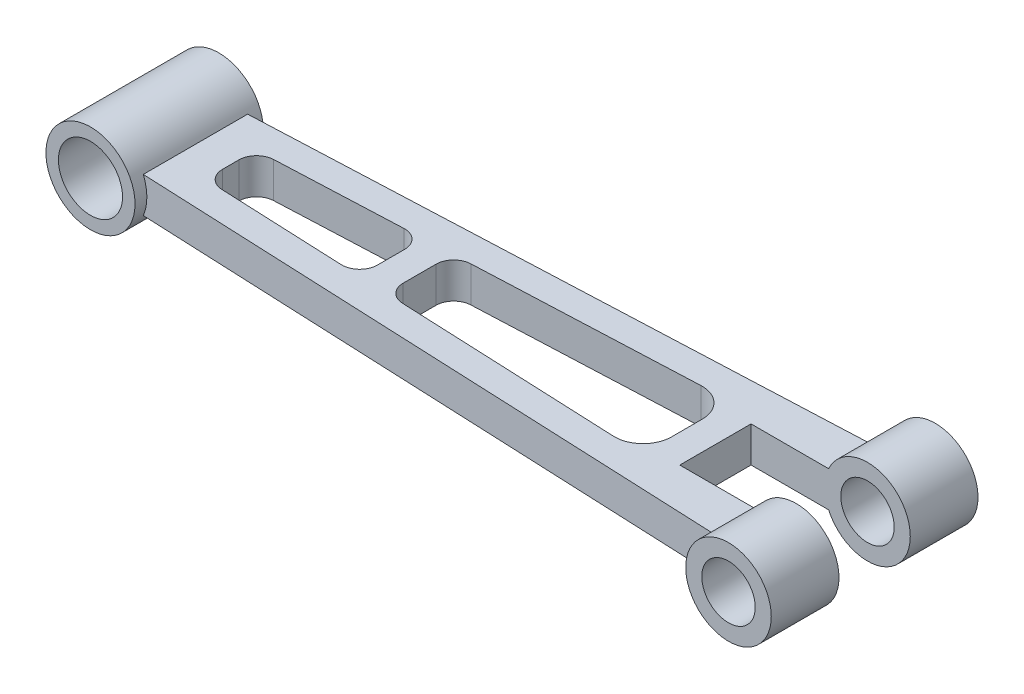
ISO-10303-21;
HEADER;
FILE_DESCRIPTION(('STEP AP214'),'2;1');
FILE_NAME('part.step','',(''),(''),'','','');
FILE_SCHEMA(('AUTOMOTIVE_DESIGN { 1 0 10303 214 1 1 1 1 }'));
ENDSEC;
DATA;
#1=APPLICATION_CONTEXT('core data for automotive mechanical design processes');
#2=APPLICATION_PROTOCOL_DEFINITION('international standard','automotive_design',2000,#1);
#3=PRODUCT_CONTEXT('',#1,'mechanical');
#4=PRODUCT('Part','Part','',(#3));
#5=PRODUCT_RELATED_PRODUCT_CATEGORY('part','',(#4));
#6=PRODUCT_DEFINITION_FORMATION('','',#4);
#7=PRODUCT_DEFINITION_CONTEXT('part definition',#1,'design');
#8=PRODUCT_DEFINITION('design','',#6,#7);
#9=PRODUCT_DEFINITION_SHAPE('','',#8);
#10=(LENGTH_UNIT() NAMED_UNIT(*) SI_UNIT(.MILLI.,.METRE.));
#11=(NAMED_UNIT(*) PLANE_ANGLE_UNIT() SI_UNIT($,.RADIAN.));
#12=(NAMED_UNIT(*) SI_UNIT($,.STERADIAN.) SOLID_ANGLE_UNIT());
#13=UNCERTAINTY_MEASURE_WITH_UNIT(LENGTH_MEASURE(1.E-05),#10,'distance_accuracy_value','');
#14=(GEOMETRIC_REPRESENTATION_CONTEXT(3) GLOBAL_UNCERTAINTY_ASSIGNED_CONTEXT((#13)) GLOBAL_UNIT_ASSIGNED_CONTEXT((#10,
#11,#12)) REPRESENTATION_CONTEXT('',''));
#15=CARTESIAN_POINT('',(0.,0.,0.));
#16=DIRECTION('',(0.,0.,1.));
#17=DIRECTION('',(1.,0.,0.));
#18=AXIS2_PLACEMENT_3D('',#15,#16,#17);
#19=CARTESIAN_POINT('',(95.,0.,29.));
#20=DIRECTION('',(0.,0.,-1.));
#21=DIRECTION('',(-1.,0.,0.));
#22=AXIS2_PLACEMENT_3D('',#19,#20,#21);
#23=CYLINDRICAL_SURFACE('',#22,12.);
#24=CARTESIAN_POINT('',(95.,0.,-29.));
#25=DIRECTION('',(0.,0.,1.));
#26=DIRECTION('',(1.,0.,0.));
#27=AXIS2_PLACEMENT_3D('',#24,#25,#26);
#28=CIRCLE('',#27,12.);
#29=CARTESIAN_POINT('',(107.,0.,-29.));
#30=VERTEX_POINT('',#29);
#31=EDGE_CURVE('E419',#30,#30,#28,.T.);
#32=ORIENTED_EDGE('',*,*,#31,.T.);
#33=EDGE_LOOP('',(#32));
#34=FACE_BOUND('',#33,.T.);
#35=DIRECTION('',(0.,0.,-1.));
#36=VECTOR('',#35,1.);
#37=CARTESIAN_POINT('',(84.0912878853643,5.,29.));
#38=LINE('',#37,#36);
#39=CARTESIAN_POINT('',(84.0912878853643,4.99999999999999,-9.99999999999999));
#40=VERTEX_POINT('',#39);
#41=CARTESIAN_POINT('',(84.0912878853642,5.,-21.9586878261897));
#42=VERTEX_POINT('',#41);
#43=EDGE_CURVE('E432',#40,#42,#38,.T.);
#44=ORIENTED_EDGE('',*,*,#43,.F.);
#45=CARTESIAN_POINT('',(95.,0.,-9.99999999999999));
#46=DIRECTION('',(0.,0.,-1.));
#47=DIRECTION('',(-1.,0.,0.));
#48=AXIS2_PLACEMENT_3D('',#45,#46,#47);
#49=CIRCLE('',#48,12.);
#50=CARTESIAN_POINT('',(84.0912878853643,-4.99999999999999,-9.99999999999999));
#51=VERTEX_POINT('',#50);
#52=EDGE_CURVE('E486',#40,#51,#49,.T.);
#53=ORIENTED_EDGE('',*,*,#52,.T.);
#54=DIRECTION('',(0.,0.,-1.));
#55=VECTOR('',#54,1.);
#56=CARTESIAN_POINT('',(84.0912878853643,-5.,29.));
#57=LINE('',#56,#55);
#58=CARTESIAN_POINT('',(84.0912878853642,-5.,-21.9586878261897));
#59=VERTEX_POINT('',#58);
#60=EDGE_CURVE('E424',#51,#59,#57,.T.);
#61=ORIENTED_EDGE('',*,*,#60,.T.);
#62=CARTESIAN_POINT('',(95.,0.,-22.4349724830322));
#63=DIRECTION('',(-0.0436193873653362,0.,-0.999048221581858));
#64=DIRECTION('',(0.999048221581858,0.,-0.0436193873653362));
#65=AXIS2_PLACEMENT_3D('',#62,#63,#64);
#66=ELLIPSE('',#65,12.0114322219598,12.);
#67=EDGE_CURVE('E437',#42,#59,#66,.F.);
#68=ORIENTED_EDGE('',*,*,#67,.F.);
#69=EDGE_LOOP('',(#44,#53,#61,#68));
#70=FACE_BOUND('',#69,.T.);
#71=ADVANCED_FACE('F46',(#34,#70),#23,.T.);
#72=CARTESIAN_POINT('',(0.,5.,0.));
#73=DIRECTION('',(0.,1.,0.));
#74=DIRECTION('',(0.,0.,1.));
#75=AXIS2_PLACEMENT_3D('',#72,#73,#74);
#76=PLANE('',#75);
#77=CARTESIAN_POINT('',(-33.6693905204358,5.,-3.80476066232324));
#78=DIRECTION('',(0.,1.,0.));
#79=DIRECTION('',(0.,0.,1.));
#80=AXIS2_PLACEMENT_3D('',#77,#78,#79);
#81=CIRCLE('',#80,5.);
#82=CARTESIAN_POINT('',(-28.6693905204358,5.,-3.80476066232321));
#83=VERTEX_POINT('',#82);
#84=CARTESIAN_POINT('',(-33.8874874572625,5.,-8.80000177023253));
#85=VERTEX_POINT('',#84);
#86=EDGE_CURVE('E391',#83,#85,#81,.T.);
#87=ORIENTED_EDGE('',*,*,#86,.F.);
#88=DIRECTION('',(0.,0.,-1.));
#89=VECTOR('',#88,1.);
#90=CARTESIAN_POINT('',(-28.6693905204358,5.,0.));
#91=LINE('',#90,#89);
#92=CARTESIAN_POINT('',(-28.6693905204358,5.,3.80476066232321));
#93=VERTEX_POINT('',#92);
#94=EDGE_CURVE('E388',#93,#83,#91,.T.);
#95=ORIENTED_EDGE('',*,*,#94,.F.);
#96=CARTESIAN_POINT('',(-33.6693905204358,5.,3.80476066232324));
#97=DIRECTION('',(0.,1.,0.));
#98=DIRECTION('',(0.,0.,1.));
#99=AXIS2_PLACEMENT_3D('',#96,#97,#98);
#100=CIRCLE('',#99,5.);
#101=CARTESIAN_POINT('',(-33.8874874572625,5.,8.80000177023253));
#102=VERTEX_POINT('',#101);
#103=EDGE_CURVE('E385',#102,#93,#100,.T.);
#104=ORIENTED_EDGE('',*,*,#103,.F.);
#105=DIRECTION('',(0.999048221581858,0.,0.0436193873653358));
#106=VECTOR('',#105,1.);
#107=CARTESIAN_POINT('',(-0.447961405576194,5.,10.2600030080629));
#108=LINE('',#107,#106);
#109=CARTESIAN_POINT('',(-68.8874874572624,5.,7.27186876843462));
#110=VERTEX_POINT('',#109);
#111=EDGE_CURVE('E382',#110,#102,#108,.T.);
#112=ORIENTED_EDGE('',*,*,#111,.F.);
#113=CARTESIAN_POINT('',(-68.6693905204358,5.,2.27662766052533));
#114=DIRECTION('',(0.,1.,0.));
#115=DIRECTION('',(0.,0.,1.));
#116=AXIS2_PLACEMENT_3D('',#113,#114,#115);
#117=CIRCLE('',#116,5.);
#118=CARTESIAN_POINT('',(-73.6693905204358,5.,2.27662766052529));
#119=VERTEX_POINT('',#118);
#120=EDGE_CURVE('E379',#119,#110,#117,.T.);
#121=ORIENTED_EDGE('',*,*,#120,.F.);
#122=DIRECTION('',(0.,0.,1.));
#123=VECTOR('',#122,1.);
#124=CARTESIAN_POINT('',(-73.6693905204358,5.,0.));
#125=LINE('',#124,#123);
#126=CARTESIAN_POINT('',(-73.6693905204358,5.,-2.27662766052528));
#127=VERTEX_POINT('',#126);
#128=EDGE_CURVE('E376',#127,#119,#125,.T.);
#129=ORIENTED_EDGE('',*,*,#128,.F.);
#130=CARTESIAN_POINT('',(-68.6693905204358,5.,-2.27662766052532));
#131=DIRECTION('',(0.,1.,0.));
#132=DIRECTION('',(0.,0.,1.));
#133=AXIS2_PLACEMENT_3D('',#130,#131,#132);
#134=CIRCLE('',#133,5.);
#135=CARTESIAN_POINT('',(-68.8874874572624,5.,-7.27186876843461));
#136=VERTEX_POINT('',#135);
#137=EDGE_CURVE('E373',#136,#127,#134,.T.);
#138=ORIENTED_EDGE('',*,*,#137,.F.);
#139=DIRECTION('',(-0.999048221581858,0.,0.043619387365336));
#140=VECTOR('',#139,1.);
#141=CARTESIAN_POINT('',(-0.447961405576197,5.,-10.2600030080629));
#142=LINE('',#141,#140);
#143=EDGE_CURVE('E370',#85,#136,#142,.T.);
#144=ORIENTED_EDGE('',*,*,#143,.F.);
#145=EDGE_LOOP('',(#87,#95,#104,#112,#121,#129,#138,#144));
#146=FACE_BOUND('',#145,.T.);
#147=CARTESIAN_POINT('',(-15.6693905204358,5.,4.59065763467646));
#148=DIRECTION('',(0.,1.,0.));
#149=DIRECTION('',(0.,0.,1.));
#150=AXIS2_PLACEMENT_3D('',#147,#148,#149);
#151=CIRCLE('',#150,5.);
#152=CARTESIAN_POINT('',(-20.6693905204358,5.,4.59065763467643));
#153=VERTEX_POINT('',#152);
#154=CARTESIAN_POINT('',(-15.8874874572624,5.,9.58589874258575));
#155=VERTEX_POINT('',#154);
#156=EDGE_CURVE('E226',#153,#155,#151,.T.);
#157=ORIENTED_EDGE('',*,*,#156,.F.);
#158=DIRECTION('',(0.,0.,1.));
#159=VECTOR('',#158,1.);
#160=CARTESIAN_POINT('',(-20.6693905204358,5.,0.));
#161=LINE('',#160,#159);
#162=CARTESIAN_POINT('',(-20.6693905204358,5.,-4.59065763467641));
#163=VERTEX_POINT('',#162);
#164=EDGE_CURVE('E365',#163,#153,#161,.T.);
#165=ORIENTED_EDGE('',*,*,#164,.F.);
#166=CARTESIAN_POINT('',(-15.6693905204358,5.,-4.59065763467645));
#167=DIRECTION('',(0.,1.,0.));
#168=DIRECTION('',(0.,0.,1.));
#169=AXIS2_PLACEMENT_3D('',#166,#167,#168);
#170=CIRCLE('',#169,5.);
#171=CARTESIAN_POINT('',(-15.8874874572624,5.,-9.58589874258574));
#172=VERTEX_POINT('',#171);
#173=EDGE_CURVE('E362',#172,#163,#170,.T.);
#174=ORIENTED_EDGE('',*,*,#173,.F.);
#175=DIRECTION('',(-0.999048221581858,0.,0.0436193873653362));
#176=VECTOR('',#175,1.);
#177=CARTESIAN_POINT('',(-0.447961405576198,5.,-10.2600030080629));
#178=LINE('',#177,#176);
#179=CARTESIAN_POINT('',(45.9816543806414,5.,-12.2871638121691));
#180=VERTEX_POINT('',#179);
#181=EDGE_CURVE('E359',#180,#172,#178,.T.);
#182=ORIENTED_EDGE('',*,*,#181,.F.);
#183=CARTESIAN_POINT('',(46.3306094795642,5.,-4.29477803951424));
#184=DIRECTION('',(0.,1.,0.));
#185=DIRECTION('',(0.,0.,1.));
#186=AXIS2_PLACEMENT_3D('',#183,#184,#185);
#187=CIRCLE('',#186,8.);
#188=CARTESIAN_POINT('',(54.3306094795642,5.,-4.29477803951421));
#189=VERTEX_POINT('',#188);
#190=EDGE_CURVE('E356',#189,#180,#187,.T.);
#191=ORIENTED_EDGE('',*,*,#190,.F.);
#192=DIRECTION('',(0.,0.,-1.));
#193=VECTOR('',#192,1.);
#194=CARTESIAN_POINT('',(54.3306094795642,5.,-1.75559403277547E-13));
#195=LINE('',#194,#193);
#196=CARTESIAN_POINT('',(54.3306094795642,5.,4.29477803951416));
#197=VERTEX_POINT('',#196);
#198=EDGE_CURVE('E353',#197,#189,#195,.T.);
#199=ORIENTED_EDGE('',*,*,#198,.F.);
#200=CARTESIAN_POINT('',(46.3306094795642,5.,4.29477803951424));
#201=DIRECTION('',(0.,1.,0.));
#202=DIRECTION('',(0.,0.,1.));
#203=AXIS2_PLACEMENT_3D('',#200,#201,#202);
#204=CIRCLE('',#203,8.);
#205=CARTESIAN_POINT('',(45.9816543806415,5.,12.2871638121691));
#206=VERTEX_POINT('',#205);
#207=EDGE_CURVE('E350',#206,#197,#204,.T.);
#208=ORIENTED_EDGE('',*,*,#207,.F.);
#209=DIRECTION('',(0.999048221581858,0.,0.0436193873653358));
#210=VECTOR('',#209,1.);
#211=CARTESIAN_POINT('',(-0.447961405576195,5.,10.2600030080629));
#212=LINE('',#211,#210);
#213=EDGE_CURVE('E297',#155,#206,#212,.T.);
#214=ORIENTED_EDGE('',*,*,#213,.F.);
#215=EDGE_LOOP('',(#157,#165,#174,#182,#191,#199,#208,#214));
#216=FACE_BOUND('',#215,.T.);
#217=DIRECTION('',(-1.,0.,0.));
#218=VECTOR('',#217,1.);
#219=CARTESIAN_POINT('',(0.,5.,-9.99999999999999));
#220=LINE('',#219,#218);
#221=CARTESIAN_POINT('',(62.3306094795642,5.,-9.99999999999999));
#222=VERTEX_POINT('',#221);
#223=EDGE_CURVE('E413',#40,#222,#220,.T.);
#224=ORIENTED_EDGE('',*,*,#223,.F.);
#225=ORIENTED_EDGE('',*,*,#43,.T.);
#226=DIRECTION('',(0.999048221581858,0.,-0.0436193873653362));
#227=VECTOR('',#226,1.);
#228=CARTESIAN_POINT('',(-0.796916504498887,5.,-18.2523887807178));
#229=LINE('',#228,#227);
#230=CARTESIAN_POINT('',(-83.5435607626103,5.,-14.6395922698934));
#231=VERTEX_POINT('',#230);
#232=EDGE_CURVE('E442',#231,#42,#229,.T.);
#233=ORIENTED_EDGE('',*,*,#232,.F.);
#234=DIRECTION('',(0.,0.,-1.));
#235=VECTOR('',#234,1.);
#236=CARTESIAN_POINT('',(-83.5435607626104,5.,18.));
#237=LINE('',#236,#235);
#238=CARTESIAN_POINT('',(-83.5435607626103,5.,14.6395922698934));
#239=VERTEX_POINT('',#238);
#240=EDGE_CURVE('E475',#239,#231,#237,.T.);
#241=ORIENTED_EDGE('',*,*,#240,.F.);
#242=DIRECTION('',(0.999048221581858,0.,0.0436193873653362));
#243=VECTOR('',#242,1.);
#244=CARTESIAN_POINT('',(-0.796916504498888,5.,18.2523887807178));
#245=LINE('',#244,#243);
#246=CARTESIAN_POINT('',(84.0912878853642,5.,21.9586878261897));
#247=VERTEX_POINT('',#246);
#248=EDGE_CURVE('E446',#239,#247,#245,.T.);
#249=ORIENTED_EDGE('',*,*,#248,.T.);
#250=CARTESIAN_POINT('',(84.0912878853643,5.,10.));
#251=VERTEX_POINT('',#250);
#252=EDGE_CURVE('E433',#247,#251,#38,.T.);
#253=ORIENTED_EDGE('',*,*,#252,.T.);
#254=DIRECTION('',(1.,0.,0.));
#255=VECTOR('',#254,1.);
#256=CARTESIAN_POINT('',(0.,5.,10.));
#257=LINE('',#256,#255);
#258=CARTESIAN_POINT('',(62.3306094795642,5.,10.));
#259=VERTEX_POINT('',#258);
#260=EDGE_CURVE('E406',#259,#251,#257,.T.);
#261=ORIENTED_EDGE('',*,*,#260,.F.);
#262=DIRECTION('',(0.,0.,1.));
#263=VECTOR('',#262,1.);
#264=CARTESIAN_POINT('',(62.3306094795642,5.,0.));
#265=LINE('',#264,#263);
#266=EDGE_CURVE('E416',#222,#259,#265,.T.);
#267=ORIENTED_EDGE('',*,*,#266,.F.);
#268=EDGE_LOOP('',(#224,#225,#233,#241,#249,#253,#261,#267));
#269=FACE_BOUND('',#268,.T.);
#270=ADVANCED_FACE('F518',(#146,#216,#269),#76,.T.);
#271=CARTESIAN_POINT('',(0.,-5.,0.));
#272=DIRECTION('',(0.,1.,0.));
#273=DIRECTION('',(0.,0.,1.));
#274=AXIS2_PLACEMENT_3D('',#271,#272,#273);
#275=PLANE('',#274);
#276=DIRECTION('',(0.,0.,-1.));
#277=VECTOR('',#276,1.);
#278=CARTESIAN_POINT('',(-28.6693905204358,-5.,0.));
#279=LINE('',#278,#277);
#280=CARTESIAN_POINT('',(-28.6693905204358,-5.,3.80476066232321));
#281=VERTEX_POINT('',#280);
#282=CARTESIAN_POINT('',(-28.6693905204358,-5.,-3.80476066232321));
#283=VERTEX_POINT('',#282);
#284=EDGE_CURVE('E56',#281,#283,#279,.T.);
#285=ORIENTED_EDGE('',*,*,#284,.T.);
#286=CARTESIAN_POINT('',(-33.6693905204358,-5.,-3.80476066232324));
#287=DIRECTION('',(0.,1.,0.));
#288=DIRECTION('',(0.,0.,1.));
#289=AXIS2_PLACEMENT_3D('',#286,#287,#288);
#290=CIRCLE('',#289,5.);
#291=CARTESIAN_POINT('',(-33.8874874572625,-5.,-8.80000177023253));
#292=VERTEX_POINT('',#291);
#293=EDGE_CURVE('E11',#283,#292,#290,.T.);
#294=ORIENTED_EDGE('',*,*,#293,.T.);
#295=DIRECTION('',(-0.999048221581858,0.,0.043619387365336));
#296=VECTOR('',#295,1.);
#297=CARTESIAN_POINT('',(-0.447961405576197,-5.,-10.2600030080629));
#298=LINE('',#297,#296);
#299=CARTESIAN_POINT('',(-68.8874874572624,-5.,-7.27186876843461));
#300=VERTEX_POINT('',#299);
#301=EDGE_CURVE('E236',#292,#300,#298,.T.);
#302=ORIENTED_EDGE('',*,*,#301,.T.);
#303=CARTESIAN_POINT('',(-68.6693905204358,-5.,-2.27662766052532));
#304=DIRECTION('',(0.,1.,0.));
#305=DIRECTION('',(0.,0.,1.));
#306=AXIS2_PLACEMENT_3D('',#303,#304,#305);
#307=CIRCLE('',#306,5.);
#308=CARTESIAN_POINT('',(-73.6693905204358,-5.,-2.27662766052528));
#309=VERTEX_POINT('',#308);
#310=EDGE_CURVE('E241',#300,#309,#307,.T.);
#311=ORIENTED_EDGE('',*,*,#310,.T.);
#312=DIRECTION('',(0.,0.,1.));
#313=VECTOR('',#312,1.);
#314=CARTESIAN_POINT('',(-73.6693905204358,-5.,0.));
#315=LINE('',#314,#313);
#316=CARTESIAN_POINT('',(-73.6693905204358,-5.,2.27662766052529));
#317=VERTEX_POINT('',#316);
#318=EDGE_CURVE('E250',#309,#317,#315,.T.);
#319=ORIENTED_EDGE('',*,*,#318,.T.);
#320=CARTESIAN_POINT('',(-68.6693905204358,-5.,2.27662766052533));
#321=DIRECTION('',(0.,1.,0.));
#322=DIRECTION('',(0.,0.,1.));
#323=AXIS2_PLACEMENT_3D('',#320,#321,#322);
#324=CIRCLE('',#323,5.);
#325=CARTESIAN_POINT('',(-68.8874874572624,-5.,7.27186876843462));
#326=VERTEX_POINT('',#325);
#327=EDGE_CURVE('E254',#317,#326,#324,.T.);
#328=ORIENTED_EDGE('',*,*,#327,.T.);
#329=DIRECTION('',(0.999048221581858,0.,0.0436193873653358));
#330=VECTOR('',#329,1.);
#331=CARTESIAN_POINT('',(-0.447961405576194,-5.,10.2600030080629));
#332=LINE('',#331,#330);
#333=CARTESIAN_POINT('',(-33.8874874572625,-5.,8.80000177023253));
#334=VERTEX_POINT('',#333);
#335=EDGE_CURVE('E258',#326,#334,#332,.T.);
#336=ORIENTED_EDGE('',*,*,#335,.T.);
#337=CARTESIAN_POINT('',(-33.6693905204358,-5.,3.80476066232324));
#338=DIRECTION('',(0.,1.,0.));
#339=DIRECTION('',(0.,0.,1.));
#340=AXIS2_PLACEMENT_3D('',#337,#338,#339);
#341=CIRCLE('',#340,5.);
#342=EDGE_CURVE('E262',#334,#281,#341,.T.);
#343=ORIENTED_EDGE('',*,*,#342,.T.);
#344=EDGE_LOOP('',(#285,#294,#302,#311,#319,#328,#336,#343));
#345=FACE_BOUND('',#344,.T.);
#346=DIRECTION('',(0.,0.,1.));
#347=VECTOR('',#346,1.);
#348=CARTESIAN_POINT('',(-20.6693905204358,-5.,0.));
#349=LINE('',#348,#347);
#350=CARTESIAN_POINT('',(-20.6693905204358,-5.,-4.59065763467641));
#351=VERTEX_POINT('',#350);
#352=CARTESIAN_POINT('',(-20.6693905204358,-5.,4.59065763467643));
#353=VERTEX_POINT('',#352);
#354=EDGE_CURVE('E234',#351,#353,#349,.T.);
#355=ORIENTED_EDGE('',*,*,#354,.T.);
#356=CARTESIAN_POINT('',(-15.6693905204358,-5.,4.59065763467646));
#357=DIRECTION('',(0.,1.,0.));
#358=DIRECTION('',(0.,0.,1.));
#359=AXIS2_PLACEMENT_3D('',#356,#357,#358);
#360=CIRCLE('',#359,5.);
#361=CARTESIAN_POINT('',(-15.8874874572624,-5.,9.58589874258575));
#362=VERTEX_POINT('',#361);
#363=EDGE_CURVE('E223',#353,#362,#360,.T.);
#364=ORIENTED_EDGE('',*,*,#363,.T.);
#365=DIRECTION('',(0.999048221581858,0.,0.0436193873653358));
#366=VECTOR('',#365,1.);
#367=CARTESIAN_POINT('',(-0.447961405576195,-5.,10.2600030080629));
#368=LINE('',#367,#366);
#369=CARTESIAN_POINT('',(45.9816543806415,-5.,12.2871638121691));
#370=VERTEX_POINT('',#369);
#371=EDGE_CURVE('E208',#362,#370,#368,.T.);
#372=ORIENTED_EDGE('',*,*,#371,.T.);
#373=CARTESIAN_POINT('',(46.3306094795642,-5.,4.29477803951424));
#374=DIRECTION('',(0.,1.,0.));
#375=DIRECTION('',(0.,0.,1.));
#376=AXIS2_PLACEMENT_3D('',#373,#374,#375);
#377=CIRCLE('',#376,8.);
#378=CARTESIAN_POINT('',(54.3306094795642,-5.,4.29477803951416));
#379=VERTEX_POINT('',#378);
#380=EDGE_CURVE('E217',#370,#379,#377,.T.);
#381=ORIENTED_EDGE('',*,*,#380,.T.);
#382=DIRECTION('',(0.,0.,-1.));
#383=VECTOR('',#382,1.);
#384=CARTESIAN_POINT('',(54.3306094795642,-5.,-1.75559403277547E-13));
#385=LINE('',#384,#383);
#386=CARTESIAN_POINT('',(54.3306094795642,-5.,-4.29477803951421));
#387=VERTEX_POINT('',#386);
#388=EDGE_CURVE('E495',#379,#387,#385,.T.);
#389=ORIENTED_EDGE('',*,*,#388,.T.);
#390=CARTESIAN_POINT('',(46.3306094795642,-5.,-4.29477803951424));
#391=DIRECTION('',(0.,1.,0.));
#392=DIRECTION('',(0.,0.,1.));
#393=AXIS2_PLACEMENT_3D('',#390,#391,#392);
#394=CIRCLE('',#393,8.);
#395=CARTESIAN_POINT('',(45.9816543806414,-5.,-12.2871638121691));
#396=VERTEX_POINT('',#395);
#397=EDGE_CURVE('E499',#387,#396,#394,.T.);
#398=ORIENTED_EDGE('',*,*,#397,.T.);
#399=DIRECTION('',(-0.999048221581858,0.,0.0436193873653362));
#400=VECTOR('',#399,1.);
#401=CARTESIAN_POINT('',(-0.447961405576198,-5.,-10.2600030080629));
#402=LINE('',#401,#400);
#403=CARTESIAN_POINT('',(-15.8874874572624,-5.,-9.58589874258574));
#404=VERTEX_POINT('',#403);
#405=EDGE_CURVE('E503',#396,#404,#402,.T.);
#406=ORIENTED_EDGE('',*,*,#405,.T.);
#407=CARTESIAN_POINT('',(-15.6693905204358,-5.,-4.59065763467645));
#408=DIRECTION('',(0.,1.,0.));
#409=DIRECTION('',(0.,0.,1.));
#410=AXIS2_PLACEMENT_3D('',#407,#408,#409);
#411=CIRCLE('',#410,5.);
#412=EDGE_CURVE('E243',#404,#351,#411,.T.);
#413=ORIENTED_EDGE('',*,*,#412,.T.);
#414=EDGE_LOOP('',(#355,#364,#372,#381,#389,#398,#406,#413));
#415=FACE_BOUND('',#414,.T.);
#416=ORIENTED_EDGE('',*,*,#60,.F.);
#417=DIRECTION('',(-1.,0.,0.));
#418=VECTOR('',#417,1.);
#419=CARTESIAN_POINT('',(0.,-5.,-9.99999999999999));
#420=LINE('',#419,#418);
#421=CARTESIAN_POINT('',(62.3306094795642,-5.,-9.99999999999999));
#422=VERTEX_POINT('',#421);
#423=EDGE_CURVE('E409',#51,#422,#420,.T.);
#424=ORIENTED_EDGE('',*,*,#423,.T.);
#425=DIRECTION('',(0.,0.,1.));
#426=VECTOR('',#425,1.);
#427=CARTESIAN_POINT('',(62.3306094795642,-5.,0.));
#428=LINE('',#427,#426);
#429=CARTESIAN_POINT('',(62.3306094795642,-5.,10.));
#430=VERTEX_POINT('',#429);
#431=EDGE_CURVE('E218',#422,#430,#428,.T.);
#432=ORIENTED_EDGE('',*,*,#431,.T.);
#433=DIRECTION('',(1.,0.,0.));
#434=VECTOR('',#433,1.);
#435=CARTESIAN_POINT('',(0.,-5.,10.));
#436=LINE('',#435,#434);
#437=CARTESIAN_POINT('',(84.0912878853643,-4.99999999999999,10.));
#438=VERTEX_POINT('',#437);
#439=EDGE_CURVE('E399',#430,#438,#436,.T.);
#440=ORIENTED_EDGE('',*,*,#439,.T.);
#441=CARTESIAN_POINT('',(84.0912878853642,-5.,21.9586878261897));
#442=VERTEX_POINT('',#441);
#443=EDGE_CURVE('E428',#442,#438,#57,.T.);
#444=ORIENTED_EDGE('',*,*,#443,.F.);
#445=DIRECTION('',(0.999048221581858,0.,0.0436193873653362));
#446=VECTOR('',#445,1.);
#447=CARTESIAN_POINT('',(-0.796916504498888,-5.,18.2523887807178));
#448=LINE('',#447,#446);
#449=CARTESIAN_POINT('',(-83.5435607626104,-5.,14.6395922698934));
#450=VERTEX_POINT('',#449);
#451=EDGE_CURVE('E447',#450,#442,#448,.T.);
#452=ORIENTED_EDGE('',*,*,#451,.F.);
#453=DIRECTION('',(0.,0.,-1.));
#454=VECTOR('',#453,1.);
#455=CARTESIAN_POINT('',(-83.5435607626104,-5.,18.));
#456=LINE('',#455,#454);
#457=CARTESIAN_POINT('',(-83.5435607626104,-5.,-14.6395922698934));
#458=VERTEX_POINT('',#457);
#459=EDGE_CURVE('E461',#450,#458,#456,.T.);
#460=ORIENTED_EDGE('',*,*,#459,.T.);
#461=DIRECTION('',(0.999048221581858,0.,-0.0436193873653362));
#462=VECTOR('',#461,1.);
#463=CARTESIAN_POINT('',(-0.796916504498887,-5.,-18.2523887807178));
#464=LINE('',#463,#462);
#465=EDGE_CURVE('E441',#458,#59,#464,.T.);
#466=ORIENTED_EDGE('',*,*,#465,.T.);
#467=EDGE_LOOP('',(#416,#424,#432,#440,#444,#452,#460,#466));
#468=FACE_BOUND('',#467,.T.);
#469=ADVANCED_FACE('F231',(#345,#415,#468),#275,.F.);
#470=CARTESIAN_POINT('',(-95.,0.,18.));
#471=DIRECTION('',(0.,0.,-1.));
#472=DIRECTION('',(-1.,0.,0.));
#473=AXIS2_PLACEMENT_3D('',#470,#471,#472);
#474=CYLINDRICAL_SURFACE('',#473,12.5);
#475=CARTESIAN_POINT('',(-95.,0.,14.1393933304149));
#476=DIRECTION('',(0.0436193873653362,0.,-0.999048221581858));
#477=DIRECTION('',(-0.999048221581858,0.,-0.0436193873653362));
#478=AXIS2_PLACEMENT_3D('',#475,#476,#477);
#479=ELLIPSE('',#478,12.5119085645415,12.5);
#480=EDGE_CURVE('E468',#239,#450,#479,.T.);
#481=ORIENTED_EDGE('',*,*,#480,.F.);
#482=ORIENTED_EDGE('',*,*,#240,.T.);
#483=CARTESIAN_POINT('',(-95.,0.,-14.1393933304149));
#484=DIRECTION('',(-0.0436193873653362,0.,-0.999048221581858));
#485=DIRECTION('',(0.999048221581858,0.,-0.0436193873653362));
#486=AXIS2_PLACEMENT_3D('',#483,#484,#485);
#487=ELLIPSE('',#486,12.5119085645415,12.5);
#488=EDGE_CURVE('E472',#231,#458,#487,.T.);
#489=ORIENTED_EDGE('',*,*,#488,.T.);
#490=ORIENTED_EDGE('',*,*,#459,.F.);
#491=EDGE_LOOP('',(#481,#482,#489,#490));
#492=FACE_BOUND('',#491,.T.);
#493=CARTESIAN_POINT('',(-95.,0.,18.));
#494=DIRECTION('',(0.,0.,1.));
#495=DIRECTION('',(1.,0.,0.));
#496=AXIS2_PLACEMENT_3D('',#493,#494,#495);
#497=CIRCLE('',#496,12.5);
#498=CARTESIAN_POINT('',(-82.5,0.,18.));
#499=VERTEX_POINT('',#498);
#500=EDGE_CURVE('E457',#499,#499,#497,.T.);
#501=ORIENTED_EDGE('',*,*,#500,.F.);
#502=EDGE_LOOP('',(#501));
#503=FACE_BOUND('',#502,.T.);
#504=CARTESIAN_POINT('',(-95.,0.,-18.));
#505=DIRECTION('',(0.,0.,1.));
#506=DIRECTION('',(1.,0.,0.));
#507=AXIS2_PLACEMENT_3D('',#504,#505,#506);
#508=CIRCLE('',#507,12.5);
#509=CARTESIAN_POINT('',(-82.5,0.,-18.));
#510=VERTEX_POINT('',#509);
#511=EDGE_CURVE('E451',#510,#510,#508,.T.);
#512=ORIENTED_EDGE('',*,*,#511,.T.);
#513=EDGE_LOOP('',(#512));
#514=FACE_BOUND('',#513,.T.);
#515=ADVANCED_FACE('F48',(#492,#503,#514),#474,.T.);
#516=CARTESIAN_POINT('',(-95.,0.,18.));
#517=DIRECTION('',(0.,0.,1.));
#518=DIRECTION('',(1.,0.,0.));
#519=AXIS2_PLACEMENT_3D('',#516,#517,#518);
#520=PLANE('',#519);
#521=CARTESIAN_POINT('',(-95.,0.,18.));
#522=DIRECTION('',(0.,0.,1.));
#523=DIRECTION('',(1.,0.,0.));
#524=AXIS2_PLACEMENT_3D('',#521,#522,#523);
#525=CIRCLE('',#524,9.);
#526=CARTESIAN_POINT('',(-86.,0.,18.));
#527=VERTEX_POINT('',#526);
#528=EDGE_CURVE('E288',#527,#527,#525,.T.);
#529=ORIENTED_EDGE('',*,*,#528,.F.);
#530=EDGE_LOOP('',(#529));
#531=FACE_BOUND('',#530,.T.);
#532=ORIENTED_EDGE('',*,*,#500,.T.);
#533=EDGE_LOOP('',(#532));
#534=FACE_BOUND('',#533,.T.);
#535=ADVANCED_FACE('F704',(#531,#534),#520,.T.);
#536=CARTESIAN_POINT('',(-95.,0.,-18.));
#537=DIRECTION('',(0.,0.,1.));
#538=DIRECTION('',(1.,0.,0.));
#539=AXIS2_PLACEMENT_3D('',#536,#537,#538);
#540=PLANE('',#539);
#541=CARTESIAN_POINT('',(-95.,0.,-18.));
#542=DIRECTION('',(0.,0.,1.));
#543=DIRECTION('',(1.,0.,0.));
#544=AXIS2_PLACEMENT_3D('',#541,#542,#543);
#545=CIRCLE('',#544,9.);
#546=CARTESIAN_POINT('',(-86.,0.,-18.));
#547=VERTEX_POINT('',#546);
#548=EDGE_CURVE('E50',#547,#547,#545,.T.);
#549=ORIENTED_EDGE('',*,*,#548,.T.);
#550=EDGE_LOOP('',(#549));
#551=FACE_BOUND('',#550,.T.);
#552=ORIENTED_EDGE('',*,*,#511,.F.);
#553=EDGE_LOOP('',(#552));
#554=FACE_BOUND('',#553,.T.);
#555=ADVANCED_FACE('F599',(#551,#554),#540,.F.);
#556=CARTESIAN_POINT('',(-0.796916504498887,5.,-18.2523887807178));
#557=DIRECTION('',(-0.0436193873653362,0.,-0.999048221581858));
#558=DIRECTION('',(-0.999048221581858,0.,0.0436193873653362));
#559=AXIS2_PLACEMENT_3D('',#556,#557,#558);
#560=PLANE('',#559);
#561=ORIENTED_EDGE('',*,*,#232,.T.);
#562=ORIENTED_EDGE('',*,*,#67,.T.);
#563=ORIENTED_EDGE('',*,*,#465,.F.);
#564=ORIENTED_EDGE('',*,*,#488,.F.);
#565=EDGE_LOOP('',(#561,#562,#563,#564));
#566=FACE_BOUND('',#565,.T.);
#567=ADVANCED_FACE('F564',(#566),#560,.T.);
#568=CARTESIAN_POINT('',(-0.796916504498888,5.,18.2523887807178));
#569=DIRECTION('',(0.0436193873653362,0.,-0.999048221581858));
#570=DIRECTION('',(-0.999048221581858,0.,-0.0436193873653362));
#571=AXIS2_PLACEMENT_3D('',#568,#569,#570);
#572=PLANE('',#571);
#573=CARTESIAN_POINT('',(95.,0.,22.4349724830322));
#574=DIRECTION('',(0.0436193873653362,0.,-0.999048221581858));
#575=DIRECTION('',(-0.999048221581858,0.,-0.0436193873653362));
#576=AXIS2_PLACEMENT_3D('',#573,#574,#575);
#577=ELLIPSE('',#576,12.0114322219598,12.);
#578=EDGE_CURVE('E478',#247,#442,#577,.F.);
#579=ORIENTED_EDGE('',*,*,#578,.F.);
#580=ORIENTED_EDGE('',*,*,#248,.F.);
#581=ORIENTED_EDGE('',*,*,#480,.T.);
#582=ORIENTED_EDGE('',*,*,#451,.T.);
#583=EDGE_LOOP('',(#579,#580,#581,#582));
#584=FACE_BOUND('',#583,.T.);
#585=ADVANCED_FACE('F555',(#584),#572,.F.);
#586=ORIENTED_EDGE('',*,*,#443,.T.);
#587=CARTESIAN_POINT('',(95.,0.,10.));
#588=DIRECTION('',(0.,0.,1.));
#589=DIRECTION('',(1.,0.,0.));
#590=AXIS2_PLACEMENT_3D('',#587,#588,#589);
#591=CIRCLE('',#590,12.);
#592=EDGE_CURVE('E482',#438,#251,#591,.T.);
#593=ORIENTED_EDGE('',*,*,#592,.T.);
#594=ORIENTED_EDGE('',*,*,#252,.F.);
#595=ORIENTED_EDGE('',*,*,#578,.T.);
#596=EDGE_LOOP('',(#586,#593,#594,#595));
#597=FACE_BOUND('',#596,.T.);
#598=CARTESIAN_POINT('',(95.,0.,29.));
#599=DIRECTION('',(0.,0.,1.));
#600=DIRECTION('',(1.,0.,0.));
#601=AXIS2_PLACEMENT_3D('',#598,#599,#600);
#602=CIRCLE('',#601,12.);
#603=CARTESIAN_POINT('',(107.,0.,29.));
#604=VERTEX_POINT('',#603);
#605=EDGE_CURVE('E420',#604,#604,#602,.T.);
#606=ORIENTED_EDGE('',*,*,#605,.F.);
#607=EDGE_LOOP('',(#606));
#608=FACE_BOUND('',#607,.T.);
#609=ADVANCED_FACE('F544',(#597,#608),#23,.T.);
#610=CARTESIAN_POINT('',(95.,0.,29.));
#611=DIRECTION('',(0.,0.,1.));
#612=DIRECTION('',(1.,0.,0.));
#613=AXIS2_PLACEMENT_3D('',#610,#611,#612);
#614=PLANE('',#613);
#615=CARTESIAN_POINT('',(95.,0.,29.));
#616=DIRECTION('',(0.,0.,1.));
#617=DIRECTION('',(1.,0.,0.));
#618=AXIS2_PLACEMENT_3D('',#615,#616,#617);
#619=CIRCLE('',#618,7.50000000000001);
#620=CARTESIAN_POINT('',(102.5,0.,29.));
#621=VERTEX_POINT('',#620);
#622=EDGE_CURVE('E282',#621,#621,#619,.T.);
#623=ORIENTED_EDGE('',*,*,#622,.F.);
#624=EDGE_LOOP('',(#623));
#625=FACE_BOUND('',#624,.T.);
#626=ORIENTED_EDGE('',*,*,#605,.T.);
#627=EDGE_LOOP('',(#626));
#628=FACE_BOUND('',#627,.T.);
#629=ADVANCED_FACE('F554',(#625,#628),#614,.T.);
#630=CARTESIAN_POINT('',(95.,0.,-29.));
#631=DIRECTION('',(0.,0.,1.));
#632=DIRECTION('',(1.,0.,0.));
#633=AXIS2_PLACEMENT_3D('',#630,#631,#632);
#634=PLANE('',#633);
#635=CARTESIAN_POINT('',(95.,0.,-29.));
#636=DIRECTION('',(0.,0.,1.));
#637=DIRECTION('',(1.,0.,0.));
#638=AXIS2_PLACEMENT_3D('',#635,#636,#637);
#639=CIRCLE('',#638,7.50000000000001);
#640=CARTESIAN_POINT('',(102.5,0.,-29.));
#641=VERTEX_POINT('',#640);
#642=EDGE_CURVE('E276',#641,#641,#639,.T.);
#643=ORIENTED_EDGE('',*,*,#642,.T.);
#644=EDGE_LOOP('',(#643));
#645=FACE_BOUND('',#644,.T.);
#646=ORIENTED_EDGE('',*,*,#31,.F.);
#647=EDGE_LOOP('',(#646));
#648=FACE_BOUND('',#647,.T.);
#649=ADVANCED_FACE('F561',(#645,#648),#634,.F.);
#650=CARTESIAN_POINT('',(62.3306094795642,-57.,-9.99999999999999));
#651=DIRECTION('',(-1.,0.,0.));
#652=DIRECTION('',(0.,0.,1.));
#653=AXIS2_PLACEMENT_3D('',#650,#651,#652);
#654=PLANE('',#653);
#655=ORIENTED_EDGE('',*,*,#266,.T.);
#656=DIRECTION('',(0.,1.,0.));
#657=VECTOR('',#656,1.);
#658=CARTESIAN_POINT('',(62.3306094795642,-57.,10.));
#659=LINE('',#658,#657);
#660=EDGE_CURVE('E394',#430,#259,#659,.T.);
#661=ORIENTED_EDGE('',*,*,#660,.F.);
#662=ORIENTED_EDGE('',*,*,#431,.F.);
#663=DIRECTION('',(0.,1.,0.));
#664=VECTOR('',#663,1.);
#665=CARTESIAN_POINT('',(62.3306094795642,-57.,-9.99999999999999));
#666=LINE('',#665,#664);
#667=EDGE_CURVE('E395',#422,#222,#666,.T.);
#668=ORIENTED_EDGE('',*,*,#667,.T.);
#669=EDGE_LOOP('',(#655,#661,#662,#668));
#670=FACE_BOUND('',#669,.T.);
#671=ADVANCED_FACE('F579',(#670),#654,.F.);
#672=CARTESIAN_POINT('',(62.3306094795642,-57.,-9.99999999999999));
#673=DIRECTION('',(0.,0.,-1.));
#674=DIRECTION('',(-1.,0.,0.));
#675=AXIS2_PLACEMENT_3D('',#672,#673,#674);
#676=PLANE('',#675);
#677=CARTESIAN_POINT('',(95.,0.,-9.99999999999999));
#678=DIRECTION('',(0.,0.,-1.));
#679=DIRECTION('',(-1.,0.,0.));
#680=AXIS2_PLACEMENT_3D('',#677,#678,#679);
#681=CIRCLE('',#680,7.50000000000001);
#682=CARTESIAN_POINT('',(87.5,0.,-9.99999999999999));
#683=VERTEX_POINT('',#682);
#684=EDGE_CURVE('E271',#683,#683,#681,.T.);
#685=ORIENTED_EDGE('',*,*,#684,.T.);
#686=EDGE_LOOP('',(#685));
#687=FACE_BOUND('',#686,.T.);
#688=ORIENTED_EDGE('',*,*,#223,.T.);
#689=ORIENTED_EDGE('',*,*,#667,.F.);
#690=ORIENTED_EDGE('',*,*,#423,.F.);
#691=ORIENTED_EDGE('',*,*,#52,.F.);
#692=EDGE_LOOP('',(#688,#689,#690,#691));
#693=FACE_BOUND('',#692,.T.);
#694=ADVANCED_FACE('F732',(#687,#693),#676,.F.);
#695=CARTESIAN_POINT('',(62.3306094795642,-57.,10.));
#696=DIRECTION('',(0.,0.,1.));
#697=DIRECTION('',(1.,0.,0.));
#698=AXIS2_PLACEMENT_3D('',#695,#696,#697);
#699=PLANE('',#698);
#700=CARTESIAN_POINT('',(95.,0.,10.));
#701=DIRECTION('',(0.,0.,1.));
#702=DIRECTION('',(1.,0.,0.));
#703=AXIS2_PLACEMENT_3D('',#700,#701,#702);
#704=CIRCLE('',#703,7.50000000000001);
#705=CARTESIAN_POINT('',(102.5,0.,10.));
#706=VERTEX_POINT('',#705);
#707=EDGE_CURVE('E268',#706,#706,#704,.T.);
#708=ORIENTED_EDGE('',*,*,#707,.T.);
#709=EDGE_LOOP('',(#708));
#710=FACE_BOUND('',#709,.T.);
#711=ORIENTED_EDGE('',*,*,#260,.T.);
#712=ORIENTED_EDGE('',*,*,#592,.F.);
#713=ORIENTED_EDGE('',*,*,#439,.F.);
#714=ORIENTED_EDGE('',*,*,#660,.T.);
#715=EDGE_LOOP('',(#711,#712,#713,#714));
#716=FACE_BOUND('',#715,.T.);
#717=ADVANCED_FACE('F576',(#710,#716),#699,.F.);
#718=CARTESIAN_POINT('',(-15.6693905204358,-57.,4.59065763467646));
#719=DIRECTION('',(0.,1.,0.));
#720=DIRECTION('',(0.,0.,1.));
#721=AXIS2_PLACEMENT_3D('',#718,#719,#720);
#722=CYLINDRICAL_SURFACE('',#721,5.);
#723=ORIENTED_EDGE('',*,*,#156,.T.);
#724=DIRECTION('',(0.,1.,0.));
#725=VECTOR('',#724,1.);
#726=CARTESIAN_POINT('',(-15.8874874572624,-57.,9.58589874258575));
#727=LINE('',#726,#725);
#728=EDGE_CURVE('E72',#362,#155,#727,.T.);
#729=ORIENTED_EDGE('',*,*,#728,.F.);
#730=ORIENTED_EDGE('',*,*,#363,.F.);
#731=DIRECTION('',(0.,1.,0.));
#732=VECTOR('',#731,1.);
#733=CARTESIAN_POINT('',(-20.6693905204358,-57.,4.59065763467643));
#734=LINE('',#733,#732);
#735=EDGE_CURVE('E292',#353,#153,#734,.T.);
#736=ORIENTED_EDGE('',*,*,#735,.T.);
#737=EDGE_LOOP('',(#723,#729,#730,#736));
#738=FACE_BOUND('',#737,.T.);
#739=ADVANCED_FACE('F221',(#738),#722,.F.);
#740=CARTESIAN_POINT('',(-20.6693905204358,-57.,-4.59065763467641));
#741=DIRECTION('',(-1.,0.,0.));
#742=DIRECTION('',(0.,0.,1.));
#743=AXIS2_PLACEMENT_3D('',#740,#741,#742);
#744=PLANE('',#743);
#745=ORIENTED_EDGE('',*,*,#164,.T.);
#746=ORIENTED_EDGE('',*,*,#735,.F.);
#747=ORIENTED_EDGE('',*,*,#354,.F.);
#748=DIRECTION('',(0.,1.,0.));
#749=VECTOR('',#748,1.);
#750=CARTESIAN_POINT('',(-20.6693905204358,-57.,-4.59065763467641));
#751=LINE('',#750,#749);
#752=EDGE_CURVE('E342',#351,#163,#751,.T.);
#753=ORIENTED_EDGE('',*,*,#752,.T.);
#754=EDGE_LOOP('',(#745,#746,#747,#753));
#755=FACE_BOUND('',#754,.T.);
#756=ADVANCED_FACE('F523',(#755),#744,.F.);
#757=CARTESIAN_POINT('',(-15.6693905204358,-57.,-4.59065763467645));
#758=DIRECTION('',(0.,1.,0.));
#759=DIRECTION('',(0.,0.,1.));
#760=AXIS2_PLACEMENT_3D('',#757,#758,#759);
#761=CYLINDRICAL_SURFACE('',#760,5.);
#762=ORIENTED_EDGE('',*,*,#173,.T.);
#763=ORIENTED_EDGE('',*,*,#752,.F.);
#764=ORIENTED_EDGE('',*,*,#412,.F.);
#765=DIRECTION('',(0.,1.,0.));
#766=VECTOR('',#765,1.);
#767=CARTESIAN_POINT('',(-15.8874874572624,-57.,-9.58589874258574));
#768=LINE('',#767,#766);
#769=EDGE_CURVE('E338',#404,#172,#768,.T.);
#770=ORIENTED_EDGE('',*,*,#769,.T.);
#771=EDGE_LOOP('',(#762,#763,#764,#770));
#772=FACE_BOUND('',#771,.T.);
#773=ADVANCED_FACE('F510',(#772),#761,.F.);
#774=CARTESIAN_POINT('',(-15.8874874572624,-57.,-9.58589874258574));
#775=DIRECTION('',(-0.0436193873653362,0.,-0.999048221581858));
#776=DIRECTION('',(-0.999048221581858,0.,0.0436193873653362));
#777=AXIS2_PLACEMENT_3D('',#774,#775,#776);
#778=PLANE('',#777);
#779=ORIENTED_EDGE('',*,*,#181,.T.);
#780=ORIENTED_EDGE('',*,*,#769,.F.);
#781=ORIENTED_EDGE('',*,*,#405,.F.);
#782=DIRECTION('',(0.,1.,0.));
#783=VECTOR('',#782,1.);
#784=CARTESIAN_POINT('',(45.9816543806414,-57.,-12.2871638121691));
#785=LINE('',#784,#783);
#786=EDGE_CURVE('E334',#396,#180,#785,.T.);
#787=ORIENTED_EDGE('',*,*,#786,.T.);
#788=EDGE_LOOP('',(#779,#780,#781,#787));
#789=FACE_BOUND('',#788,.T.);
#790=ADVANCED_FACE('F513',(#789),#778,.F.);
#791=CARTESIAN_POINT('',(46.3306094795642,-57.,-4.29477803951424));
#792=DIRECTION('',(0.,1.,0.));
#793=DIRECTION('',(0.,0.,1.));
#794=AXIS2_PLACEMENT_3D('',#791,#792,#793);
#795=CYLINDRICAL_SURFACE('',#794,8.);
#796=ORIENTED_EDGE('',*,*,#190,.T.);
#797=ORIENTED_EDGE('',*,*,#786,.F.);
#798=ORIENTED_EDGE('',*,*,#397,.F.);
#799=DIRECTION('',(0.,1.,0.));
#800=VECTOR('',#799,1.);
#801=CARTESIAN_POINT('',(54.3306094795642,-57.,-4.29477803951421));
#802=LINE('',#801,#800);
#803=EDGE_CURVE('E330',#387,#189,#802,.T.);
#804=ORIENTED_EDGE('',*,*,#803,.T.);
#805=EDGE_LOOP('',(#796,#797,#798,#804));
#806=FACE_BOUND('',#805,.T.);
#807=ADVANCED_FACE('F532',(#806),#795,.F.);
#808=CARTESIAN_POINT('',(54.3306094795642,-57.,-4.29477803951421));
#809=DIRECTION('',(1.,0.,0.));
#810=DIRECTION('',(0.,0.,-1.));
#811=AXIS2_PLACEMENT_3D('',#808,#809,#810);
#812=PLANE('',#811);
#813=ORIENTED_EDGE('',*,*,#198,.T.);
#814=ORIENTED_EDGE('',*,*,#803,.F.);
#815=ORIENTED_EDGE('',*,*,#388,.F.);
#816=DIRECTION('',(0.,1.,0.));
#817=VECTOR('',#816,1.);
#818=CARTESIAN_POINT('',(54.3306094795642,-57.,4.29477803951416));
#819=LINE('',#818,#817);
#820=EDGE_CURVE('E326',#379,#197,#819,.T.);
#821=ORIENTED_EDGE('',*,*,#820,.T.);
#822=EDGE_LOOP('',(#813,#814,#815,#821));
#823=FACE_BOUND('',#822,.T.);
#824=ADVANCED_FACE('F530',(#823),#812,.F.);
#825=CARTESIAN_POINT('',(46.3306094795642,-57.,4.29477803951424));
#826=DIRECTION('',(0.,1.,0.));
#827=DIRECTION('',(0.,0.,1.));
#828=AXIS2_PLACEMENT_3D('',#825,#826,#827);
#829=CYLINDRICAL_SURFACE('',#828,8.);
#830=ORIENTED_EDGE('',*,*,#207,.T.);
#831=ORIENTED_EDGE('',*,*,#820,.F.);
#832=ORIENTED_EDGE('',*,*,#380,.F.);
#833=DIRECTION('',(0.,1.,0.));
#834=VECTOR('',#833,1.);
#835=CARTESIAN_POINT('',(45.9816543806415,-57.,12.2871638121691));
#836=LINE('',#835,#834);
#837=EDGE_CURVE('E211',#370,#206,#836,.T.);
#838=ORIENTED_EDGE('',*,*,#837,.T.);
#839=EDGE_LOOP('',(#830,#831,#832,#838));
#840=FACE_BOUND('',#839,.T.);
#841=ADVANCED_FACE('F526',(#840),#829,.F.);
#842=CARTESIAN_POINT('',(-15.8874874572624,-57.,9.58589874258575));
#843=DIRECTION('',(-0.0436193873653358,0.,0.999048221581858));
#844=DIRECTION('',(0.999048221581858,0.,0.0436193873653358));
#845=AXIS2_PLACEMENT_3D('',#842,#843,#844);
#846=PLANE('',#845);
#847=ORIENTED_EDGE('',*,*,#213,.T.);
#848=ORIENTED_EDGE('',*,*,#837,.F.);
#849=ORIENTED_EDGE('',*,*,#371,.F.);
#850=ORIENTED_EDGE('',*,*,#728,.T.);
#851=EDGE_LOOP('',(#847,#848,#849,#850));
#852=FACE_BOUND('',#851,.T.);
#853=ADVANCED_FACE('F209',(#852),#846,.F.);
#854=CARTESIAN_POINT('',(-33.6693905204358,-57.,-3.80476066232324));
#855=DIRECTION('',(0.,1.,0.));
#856=DIRECTION('',(0.,0.,1.));
#857=AXIS2_PLACEMENT_3D('',#854,#855,#856);
#858=CYLINDRICAL_SURFACE('',#857,5.);
#859=ORIENTED_EDGE('',*,*,#86,.T.);
#860=DIRECTION('',(0.,1.,0.));
#861=VECTOR('',#860,1.);
#862=CARTESIAN_POINT('',(-33.8874874572625,-57.,-8.80000177023253));
#863=LINE('',#862,#861);
#864=EDGE_CURVE('E64',#292,#85,#863,.T.);
#865=ORIENTED_EDGE('',*,*,#864,.F.);
#866=ORIENTED_EDGE('',*,*,#293,.F.);
#867=DIRECTION('',(0.,1.,0.));
#868=VECTOR('',#867,1.);
#869=CARTESIAN_POINT('',(-28.6693905204358,-57.,-3.80476066232321));
#870=LINE('',#869,#868);
#871=EDGE_CURVE('E293',#283,#83,#870,.T.);
#872=ORIENTED_EDGE('',*,*,#871,.T.);
#873=EDGE_LOOP('',(#859,#865,#866,#872));
#874=FACE_BOUND('',#873,.T.);
#875=ADVANCED_FACE('F618',(#874),#858,.F.);
#876=CARTESIAN_POINT('',(-28.6693905204358,-57.,-3.80476066232321));
#877=DIRECTION('',(1.,0.,0.));
#878=DIRECTION('',(0.,0.,-1.));
#879=AXIS2_PLACEMENT_3D('',#876,#877,#878);
#880=PLANE('',#879);
#881=ORIENTED_EDGE('',*,*,#94,.T.);
#882=ORIENTED_EDGE('',*,*,#871,.F.);
#883=ORIENTED_EDGE('',*,*,#284,.F.);
#884=DIRECTION('',(0.,1.,0.));
#885=VECTOR('',#884,1.);
#886=CARTESIAN_POINT('',(-28.6693905204358,-57.,3.80476066232321));
#887=LINE('',#886,#885);
#888=EDGE_CURVE('E298',#281,#93,#887,.T.);
#889=ORIENTED_EDGE('',*,*,#888,.T.);
#890=EDGE_LOOP('',(#881,#882,#883,#889));
#891=FACE_BOUND('',#890,.T.);
#892=ADVANCED_FACE('F614',(#891),#880,.F.);
#893=CARTESIAN_POINT('',(-33.6693905204358,-57.,3.80476066232324));
#894=DIRECTION('',(0.,1.,0.));
#895=DIRECTION('',(0.,0.,1.));
#896=AXIS2_PLACEMENT_3D('',#893,#894,#895);
#897=CYLINDRICAL_SURFACE('',#896,5.);
#898=ORIENTED_EDGE('',*,*,#103,.T.);
#899=ORIENTED_EDGE('',*,*,#888,.F.);
#900=ORIENTED_EDGE('',*,*,#342,.F.);
#901=DIRECTION('',(0.,1.,0.));
#902=VECTOR('',#901,1.);
#903=CARTESIAN_POINT('',(-33.8874874572625,-57.,8.80000177023253));
#904=LINE('',#903,#902);
#905=EDGE_CURVE('E302',#334,#102,#904,.T.);
#906=ORIENTED_EDGE('',*,*,#905,.T.);
#907=EDGE_LOOP('',(#898,#899,#900,#906));
#908=FACE_BOUND('',#907,.T.);
#909=ADVANCED_FACE('F617',(#908),#897,.F.);
#910=CARTESIAN_POINT('',(-68.8874874572624,-57.,7.27186876843462));
#911=DIRECTION('',(-0.0436193873653358,0.,0.999048221581858));
#912=DIRECTION('',(0.999048221581858,0.,0.0436193873653358));
#913=AXIS2_PLACEMENT_3D('',#910,#911,#912);
#914=PLANE('',#913);
#915=ORIENTED_EDGE('',*,*,#111,.T.);
#916=ORIENTED_EDGE('',*,*,#905,.F.);
#917=ORIENTED_EDGE('',*,*,#335,.F.);
#918=DIRECTION('',(0.,1.,0.));
#919=VECTOR('',#918,1.);
#920=CARTESIAN_POINT('',(-68.8874874572624,-57.,7.27186876843462));
#921=LINE('',#920,#919);
#922=EDGE_CURVE('E306',#326,#110,#921,.T.);
#923=ORIENTED_EDGE('',*,*,#922,.T.);
#924=EDGE_LOOP('',(#915,#916,#917,#923));
#925=FACE_BOUND('',#924,.T.);
#926=ADVANCED_FACE('F622',(#925),#914,.F.);
#927=CARTESIAN_POINT('',(-68.6693905204358,-57.,2.27662766052533));
#928=DIRECTION('',(0.,1.,0.));
#929=DIRECTION('',(0.,0.,1.));
#930=AXIS2_PLACEMENT_3D('',#927,#928,#929);
#931=CYLINDRICAL_SURFACE('',#930,5.);
#932=ORIENTED_EDGE('',*,*,#120,.T.);
#933=ORIENTED_EDGE('',*,*,#922,.F.);
#934=ORIENTED_EDGE('',*,*,#327,.F.);
#935=DIRECTION('',(0.,1.,0.));
#936=VECTOR('',#935,1.);
#937=CARTESIAN_POINT('',(-73.6693905204358,-57.,2.27662766052529));
#938=LINE('',#937,#936);
#939=EDGE_CURVE('E310',#317,#119,#938,.T.);
#940=ORIENTED_EDGE('',*,*,#939,.T.);
#941=EDGE_LOOP('',(#932,#933,#934,#940));
#942=FACE_BOUND('',#941,.T.);
#943=ADVANCED_FACE('F626',(#942),#931,.F.);
#944=CARTESIAN_POINT('',(-73.6693905204358,-57.,-2.27662766052529));
#945=DIRECTION('',(-1.,0.,0.));
#946=DIRECTION('',(0.,0.,1.));
#947=AXIS2_PLACEMENT_3D('',#944,#945,#946);
#948=PLANE('',#947);
#949=ORIENTED_EDGE('',*,*,#128,.T.);
#950=ORIENTED_EDGE('',*,*,#939,.F.);
#951=ORIENTED_EDGE('',*,*,#318,.F.);
#952=DIRECTION('',(0.,1.,0.));
#953=VECTOR('',#952,1.);
#954=CARTESIAN_POINT('',(-73.6693905204358,-57.,-2.27662766052528));
#955=LINE('',#954,#953);
#956=EDGE_CURVE('E314',#309,#127,#955,.T.);
#957=ORIENTED_EDGE('',*,*,#956,.T.);
#958=EDGE_LOOP('',(#949,#950,#951,#957));
#959=FACE_BOUND('',#958,.T.);
#960=ADVANCED_FACE('F630',(#959),#948,.F.);
#961=CARTESIAN_POINT('',(-68.6693905204358,-57.,-2.27662766052532));
#962=DIRECTION('',(0.,1.,0.));
#963=DIRECTION('',(0.,0.,1.));
#964=AXIS2_PLACEMENT_3D('',#961,#962,#963);
#965=CYLINDRICAL_SURFACE('',#964,5.);
#966=ORIENTED_EDGE('',*,*,#137,.T.);
#967=ORIENTED_EDGE('',*,*,#956,.F.);
#968=ORIENTED_EDGE('',*,*,#310,.F.);
#969=DIRECTION('',(0.,1.,0.));
#970=VECTOR('',#969,1.);
#971=CARTESIAN_POINT('',(-68.8874874572624,-57.,-7.27186876843461));
#972=LINE('',#971,#970);
#973=EDGE_CURVE('E318',#300,#136,#972,.T.);
#974=ORIENTED_EDGE('',*,*,#973,.T.);
#975=EDGE_LOOP('',(#966,#967,#968,#974));
#976=FACE_BOUND('',#975,.T.);
#977=ADVANCED_FACE('F634',(#976),#965,.F.);
#978=CARTESIAN_POINT('',(-68.8874874572624,-57.,-7.27186876843461));
#979=DIRECTION('',(-0.043619387365336,0.,-0.999048221581858));
#980=DIRECTION('',(-0.999048221581858,0.,0.043619387365336));
#981=AXIS2_PLACEMENT_3D('',#978,#979,#980);
#982=PLANE('',#981);
#983=ORIENTED_EDGE('',*,*,#143,.T.);
#984=ORIENTED_EDGE('',*,*,#973,.F.);
#985=ORIENTED_EDGE('',*,*,#301,.F.);
#986=ORIENTED_EDGE('',*,*,#864,.T.);
#987=EDGE_LOOP('',(#983,#984,#985,#986));
#988=FACE_BOUND('',#987,.T.);
#989=ADVANCED_FACE('F638',(#988),#982,.F.);
#990=CARTESIAN_POINT('',(95.,0.,-62.));
#991=DIRECTION('',(0.,0.,1.));
#992=DIRECTION('',(1.,0.,0.));
#993=AXIS2_PLACEMENT_3D('',#990,#991,#992);
#994=CYLINDRICAL_SURFACE('',#993,7.50000000000001);
#995=ORIENTED_EDGE('',*,*,#622,.T.);
#996=EDGE_LOOP('',(#995));
#997=FACE_BOUND('',#996,.T.);
#998=ORIENTED_EDGE('',*,*,#707,.F.);
#999=EDGE_LOOP('',(#998));
#1000=FACE_BOUND('',#999,.T.);
#1001=ADVANCED_FACE('F610',(#997,#1000),#994,.F.);
#1002=ORIENTED_EDGE('',*,*,#684,.F.);
#1003=EDGE_LOOP('',(#1002));
#1004=FACE_BOUND('',#1003,.T.);
#1005=ORIENTED_EDGE('',*,*,#642,.F.);
#1006=EDGE_LOOP('',(#1005));
#1007=FACE_BOUND('',#1006,.T.);
#1008=ADVANCED_FACE('F604',(#1004,#1007),#994,.F.);
#1009=CARTESIAN_POINT('',(-95.,0.,-62.));
#1010=DIRECTION('',(0.,0.,1.));
#1011=DIRECTION('',(1.,0.,0.));
#1012=AXIS2_PLACEMENT_3D('',#1009,#1010,#1011);
#1013=CYLINDRICAL_SURFACE('',#1012,9.);
#1014=ORIENTED_EDGE('',*,*,#528,.T.);
#1015=EDGE_LOOP('',(#1014));
#1016=FACE_BOUND('',#1015,.T.);
#1017=ORIENTED_EDGE('',*,*,#548,.F.);
#1018=EDGE_LOOP('',(#1017));
#1019=FACE_BOUND('',#1018,.T.);
#1020=ADVANCED_FACE('F602',(#1016,#1019),#1013,.F.);
#1021=CLOSED_SHELL('',(#71,#270,#469,#515,#535,#555,#567,#585,#609,#629,#649,#671,#694,#717,
#739,#756,#773,#790,#807,#824,#841,#853,#875,#892,#909,#926,#943,#960,#977,#989,#1001,#1008,#1020));
#1022=MANIFOLD_SOLID_BREP('B2',#1021);
#1023=ADVANCED_BREP_SHAPE_REPRESENTATION('',(#18,#1022),#14);
#1024=SHAPE_DEFINITION_REPRESENTATION(#9,#1023);
ENDSEC;
END-ISO-10303-21;
